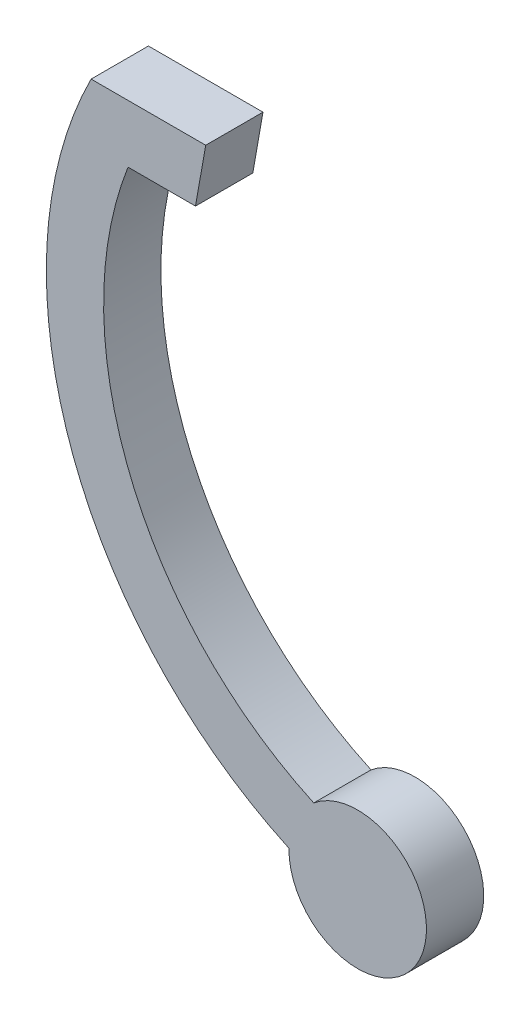
ISO-10303-21;
HEADER;
FILE_DESCRIPTION(('STEP AP214'),'2;1');
FILE_NAME('part.step','',(''),(''),'','','');
FILE_SCHEMA(('AUTOMOTIVE_DESIGN { 1 0 10303 214 1 1 1 1 }'));
ENDSEC;
DATA;
#1=APPLICATION_CONTEXT('core data for automotive mechanical design processes');
#2=APPLICATION_PROTOCOL_DEFINITION('international standard','automotive_design',2000,#1);
#3=PRODUCT_CONTEXT('',#1,'mechanical');
#4=PRODUCT('Part','Part','',(#3));
#5=PRODUCT_RELATED_PRODUCT_CATEGORY('part','',(#4));
#6=PRODUCT_DEFINITION_FORMATION('','',#4);
#7=PRODUCT_DEFINITION_CONTEXT('part definition',#1,'design');
#8=PRODUCT_DEFINITION('design','',#6,#7);
#9=PRODUCT_DEFINITION_SHAPE('','',#8);
#10=(LENGTH_UNIT() NAMED_UNIT(*) SI_UNIT(.MILLI.,.METRE.));
#11=(NAMED_UNIT(*) PLANE_ANGLE_UNIT() SI_UNIT($,.RADIAN.));
#12=(NAMED_UNIT(*) SI_UNIT($,.STERADIAN.) SOLID_ANGLE_UNIT());
#13=UNCERTAINTY_MEASURE_WITH_UNIT(LENGTH_MEASURE(1.E-05),#10,'distance_accuracy_value','');
#14=(GEOMETRIC_REPRESENTATION_CONTEXT(3) GLOBAL_UNCERTAINTY_ASSIGNED_CONTEXT((#13)) GLOBAL_UNIT_ASSIGNED_CONTEXT((#10,
#11,#12)) REPRESENTATION_CONTEXT('',''));
#15=CARTESIAN_POINT('',(0.,0.,0.));
#16=DIRECTION('',(0.,0.,1.));
#17=DIRECTION('',(1.,0.,0.));
#18=AXIS2_PLACEMENT_3D('',#15,#16,#17);
#19=CARTESIAN_POINT('',(9.26295980228753,33.1948316585105,-4.));
#20=DIRECTION('',(0.,0.,1.));
#21=DIRECTION('',(1.,0.,0.));
#22=AXIS2_PLACEMENT_3D('',#19,#20,#21);
#23=CYLINDRICAL_SURFACE('',#22,36.4391896161672);
#24=CARTESIAN_POINT('',(9.26295980228753,33.1948316585105,5.));
#25=DIRECTION('',(0.,0.,1.));
#26=DIRECTION('',(1.,0.,0.));
#27=AXIS2_PLACEMENT_3D('',#24,#25,#26);
#28=CIRCLE('',#27,36.4391896161672);
#29=CARTESIAN_POINT('',(-23.2673563555841,49.6141212458192,5.));
#30=VERTEX_POINT('',#29);
#31=CARTESIAN_POINT('',(-5.99906740376908,0.10578414359131,5.));
#32=VERTEX_POINT('',#31);
#33=EDGE_CURVE('E128',#30,#32,#28,.T.);
#34=ORIENTED_EDGE('',*,*,#33,.F.);
#35=DIRECTION('',(0.,0.,1.));
#36=VECTOR('',#35,1.);
#37=CARTESIAN_POINT('',(-23.2673563555841,49.6141212458192,-4.));
#38=LINE('',#37,#36);
#39=CARTESIAN_POINT('',(-23.2673563555841,49.6141212458192,0.));
#40=VERTEX_POINT('',#39);
#41=EDGE_CURVE('E109',#40,#30,#38,.T.);
#42=ORIENTED_EDGE('',*,*,#41,.F.);
#43=CARTESIAN_POINT('',(9.26295980228753,33.1948316585105,0.));
#44=DIRECTION('',(0.,0.,-1.));
#45=DIRECTION('',(-1.,0.,0.));
#46=AXIS2_PLACEMENT_3D('',#43,#44,#45);
#47=CIRCLE('',#46,36.4391896161672);
#48=CARTESIAN_POINT('',(-5.99906740376908,0.10578414359131,0.));
#49=VERTEX_POINT('',#48);
#50=EDGE_CURVE('E91',#49,#40,#47,.T.);
#51=ORIENTED_EDGE('',*,*,#50,.F.);
#52=DIRECTION('',(0.,0.,1.));
#53=VECTOR('',#52,1.);
#54=CARTESIAN_POINT('',(-5.99906740376907,0.10578414359131,-4.));
#55=LINE('',#54,#53);
#56=EDGE_CURVE('E111',#49,#32,#55,.T.);
#57=ORIENTED_EDGE('',*,*,#56,.T.);
#58=EDGE_LOOP('',(#34,#42,#51,#57));
#59=FACE_BOUND('',#58,.T.);
#60=ADVANCED_FACE('F36',(#59),#23,.T.);
#61=CARTESIAN_POINT('',(-23.2673563555841,49.6141212458192,-4.));
#62=DIRECTION('',(0.,-1.,0.));
#63=DIRECTION('',(0.,0.,-1.));
#64=AXIS2_PLACEMENT_3D('',#61,#62,#63);
#65=PLANE('',#64);
#66=DIRECTION('',(1.,0.,0.));
#67=VECTOR('',#66,1.);
#68=CARTESIAN_POINT('',(-31.0251504460411,49.6141212458192,5.));
#69=LINE('',#68,#67);
#70=CARTESIAN_POINT('',(-13.2673563555841,49.6141212458192,5.));
#71=VERTEX_POINT('',#70);
#72=EDGE_CURVE('E96',#30,#71,#69,.T.);
#73=ORIENTED_EDGE('',*,*,#72,.T.);
#74=DIRECTION('',(0.,0.,1.));
#75=VECTOR('',#74,1.);
#76=CARTESIAN_POINT('',(-13.2673563555841,49.6141212458192,-4.));
#77=LINE('',#76,#75);
#78=CARTESIAN_POINT('',(-13.2673563555841,49.6141212458192,0.));
#79=VERTEX_POINT('',#78);
#80=EDGE_CURVE('E103',#79,#71,#77,.T.);
#81=ORIENTED_EDGE('',*,*,#80,.F.);
#82=DIRECTION('',(-1.,0.,0.));
#83=VECTOR('',#82,1.);
#84=CARTESIAN_POINT('',(-4.47625446970178,49.6141212458192,0.));
#85=LINE('',#84,#83);
#86=EDGE_CURVE('E86',#79,#40,#85,.T.);
#87=ORIENTED_EDGE('',*,*,#86,.T.);
#88=ORIENTED_EDGE('',*,*,#41,.T.);
#89=EDGE_LOOP('',(#73,#81,#87,#88));
#90=FACE_BOUND('',#89,.T.);
#91=ADVANCED_FACE('F108',(#90),#65,.F.);
#92=CARTESIAN_POINT('',(-13.2673563555841,49.6141212458192,-4.));
#93=DIRECTION('',(-0.984807753012207,0.173648177666934,0.));
#94=DIRECTION('',(-0.173648177666934,-0.984807753012207,0.));
#95=AXIS2_PLACEMENT_3D('',#92,#93,#94);
#96=PLANE('',#95);
#97=DIRECTION('',(0.173648177666934,0.984807753012207,0.));
#98=VECTOR('',#97,1.);
#99=CARTESIAN_POINT('',(-13.2673563555841,49.6141212458192,5.));
#100=LINE('',#99,#98);
#101=CARTESIAN_POINT('',(-14.1573566450321,44.5666787848182,5.));
#102=VERTEX_POINT('',#101);
#103=EDGE_CURVE('E136',#102,#71,#100,.T.);
#104=ORIENTED_EDGE('',*,*,#103,.F.);
#105=DIRECTION('',(0.,0.,1.));
#106=VECTOR('',#105,1.);
#107=CARTESIAN_POINT('',(-14.1573566450321,44.5666787848182,-4.));
#108=LINE('',#107,#106);
#109=CARTESIAN_POINT('',(-14.1573566450321,44.5666787848182,0.));
#110=VERTEX_POINT('',#109);
#111=EDGE_CURVE('E105',#110,#102,#108,.T.);
#112=ORIENTED_EDGE('',*,*,#111,.F.);
#113=DIRECTION('',(-0.173648177666934,-0.984807753012207,0.));
#114=VECTOR('',#113,1.);
#115=CARTESIAN_POINT('',(-13.2673563555841,49.6141212458192,0.));
#116=LINE('',#115,#114);
#117=EDGE_CURVE('E89',#79,#110,#116,.T.);
#118=ORIENTED_EDGE('',*,*,#117,.F.);
#119=ORIENTED_EDGE('',*,*,#80,.T.);
#120=EDGE_LOOP('',(#104,#112,#118,#119));
#121=FACE_BOUND('',#120,.T.);
#122=ADVANCED_FACE('F102',(#121),#96,.F.);
#123=CARTESIAN_POINT('',(-14.1573566450321,44.5666787848182,-4.));
#124=DIRECTION('',(0.,1.,0.));
#125=DIRECTION('',(-1.,0.,0.));
#126=AXIS2_PLACEMENT_3D('',#123,#124,#125);
#127=PLANE('',#126);
#128=DIRECTION('',(1.,0.,0.));
#129=VECTOR('',#128,1.);
#130=CARTESIAN_POINT('',(-14.1573566450321,44.5666787848182,5.));
#131=LINE('',#130,#129);
#132=CARTESIAN_POINT('',(-20.0475116483255,44.5666787848182,5.));
#133=VERTEX_POINT('',#132);
#134=EDGE_CURVE('E134',#133,#102,#131,.T.);
#135=ORIENTED_EDGE('',*,*,#134,.F.);
#136=DIRECTION('',(0.,0.,1.));
#137=VECTOR('',#136,1.);
#138=CARTESIAN_POINT('',(-20.0475116483255,44.5666787848182,-4.));
#139=LINE('',#138,#137);
#140=CARTESIAN_POINT('',(-20.0475116483255,44.5666787848182,0.));
#141=VERTEX_POINT('',#140);
#142=EDGE_CURVE('E113',#141,#133,#139,.T.);
#143=ORIENTED_EDGE('',*,*,#142,.F.);
#144=DIRECTION('',(-1.,0.,0.));
#145=VECTOR('',#144,1.);
#146=CARTESIAN_POINT('',(-14.1573566450321,44.5666787848182,0.));
#147=LINE('',#146,#145);
#148=EDGE_CURVE('E51',#110,#141,#147,.T.);
#149=ORIENTED_EDGE('',*,*,#148,.F.);
#150=ORIENTED_EDGE('',*,*,#111,.T.);
#151=EDGE_LOOP('',(#135,#143,#149,#150));
#152=FACE_BOUND('',#151,.T.);
#153=ADVANCED_FACE('F143',(#152),#127,.F.);
#154=CARTESIAN_POINT('',(9.26295980228753,33.1948316585105,-4.));
#155=DIRECTION('',(0.,0.,1.));
#156=DIRECTION('',(1.,0.,0.));
#157=AXIS2_PLACEMENT_3D('',#154,#155,#156);
#158=CYLINDRICAL_SURFACE('',#157,31.4391896161672);
#159=CARTESIAN_POINT('',(9.26295980228753,33.1948316585105,5.));
#160=DIRECTION('',(0.,0.,1.));
#161=DIRECTION('',(1.,0.,0.));
#162=AXIS2_PLACEMENT_3D('',#159,#160,#161);
#163=CIRCLE('',#162,31.4391896161672);
#164=CARTESIAN_POINT('',(-3.83534680685851,4.61412124581921,5.));
#165=VERTEX_POINT('',#164);
#166=EDGE_CURVE('E12',#165,#133,#163,.F.);
#167=ORIENTED_EDGE('',*,*,#166,.F.);
#168=DIRECTION('',(0.,0.,1.));
#169=VECTOR('',#168,1.);
#170=CARTESIAN_POINT('',(-3.83534680685851,4.61412124581921,-4.));
#171=LINE('',#170,#169);
#172=CARTESIAN_POINT('',(-3.83534680685851,4.61412124581921,0.));
#173=VERTEX_POINT('',#172);
#174=EDGE_CURVE('E124',#173,#165,#171,.T.);
#175=ORIENTED_EDGE('',*,*,#174,.F.);
#176=CARTESIAN_POINT('',(9.26295980228753,33.1948316585105,0.));
#177=DIRECTION('',(0.,0.,-1.));
#178=DIRECTION('',(-1.,0.,0.));
#179=AXIS2_PLACEMENT_3D('',#176,#177,#178);
#180=CIRCLE('',#179,31.4391896161672);
#181=EDGE_CURVE('E44',#141,#173,#180,.F.);
#182=ORIENTED_EDGE('',*,*,#181,.F.);
#183=ORIENTED_EDGE('',*,*,#142,.T.);
#184=EDGE_LOOP('',(#167,#175,#182,#183));
#185=FACE_BOUND('',#184,.T.);
#186=ADVANCED_FACE('F125',(#185),#158,.F.);
#187=CARTESIAN_POINT('',(0.,0.,5.));
#188=DIRECTION('',(0.,0.,-1.));
#189=DIRECTION('',(-1.,0.,0.));
#190=AXIS2_PLACEMENT_3D('',#187,#188,#189);
#191=CYLINDRICAL_SURFACE('',#190,6.);
#192=CARTESIAN_POINT('',(0.,0.,5.));
#193=DIRECTION('',(0.,0.,1.));
#194=DIRECTION('',(1.,0.,0.));
#195=AXIS2_PLACEMENT_3D('',#192,#193,#194);
#196=CIRCLE('',#195,6.);
#197=EDGE_CURVE('E120',#165,#32,#196,.F.);
#198=ORIENTED_EDGE('',*,*,#197,.T.);
#199=ORIENTED_EDGE('',*,*,#56,.F.);
#200=CARTESIAN_POINT('',(0.,0.,0.));
#201=DIRECTION('',(0.,0.,1.));
#202=DIRECTION('',(1.,0.,0.));
#203=AXIS2_PLACEMENT_3D('',#200,#201,#202);
#204=CIRCLE('',#203,6.);
#205=EDGE_CURVE('E119',#173,#49,#204,.F.);
#206=ORIENTED_EDGE('',*,*,#205,.F.);
#207=ORIENTED_EDGE('',*,*,#174,.T.);
#208=EDGE_LOOP('',(#198,#199,#206,#207));
#209=FACE_BOUND('',#208,.T.);
#210=ADVANCED_FACE('F38',(#209),#191,.T.);
#211=CARTESIAN_POINT('',(0.,0.,5.));
#212=DIRECTION('',(0.,0.,1.));
#213=DIRECTION('',(1.,0.,0.));
#214=AXIS2_PLACEMENT_3D('',#211,#212,#213);
#215=PLANE('',#214);
#216=ORIENTED_EDGE('',*,*,#197,.F.);
#217=ORIENTED_EDGE('',*,*,#166,.T.);
#218=ORIENTED_EDGE('',*,*,#134,.T.);
#219=ORIENTED_EDGE('',*,*,#103,.T.);
#220=ORIENTED_EDGE('',*,*,#72,.F.);
#221=ORIENTED_EDGE('',*,*,#33,.T.);
#222=EDGE_LOOP('',(#216,#217,#218,#219,#220,#221));
#223=FACE_BOUND('',#222,.T.);
#224=ADVANCED_FACE('F145',(#223),#215,.T.);
#225=CARTESIAN_POINT('',(0.,0.,0.));
#226=DIRECTION('',(0.,0.,1.));
#227=DIRECTION('',(1.,0.,0.));
#228=AXIS2_PLACEMENT_3D('',#225,#226,#227);
#229=PLANE('',#228);
#230=ORIENTED_EDGE('',*,*,#205,.T.);
#231=ORIENTED_EDGE('',*,*,#50,.T.);
#232=ORIENTED_EDGE('',*,*,#86,.F.);
#233=ORIENTED_EDGE('',*,*,#117,.T.);
#234=ORIENTED_EDGE('',*,*,#148,.T.);
#235=ORIENTED_EDGE('',*,*,#181,.T.);
#236=EDGE_LOOP('',(#230,#231,#232,#233,#234,#235));
#237=FACE_BOUND('',#236,.T.);
#238=ADVANCED_FACE('F88',(#237),#229,.F.);
#239=CLOSED_SHELL('',(#60,#91,#122,#153,#186,#210,#224,#238));
#240=MANIFOLD_SOLID_BREP('B2',#239);
#241=ADVANCED_BREP_SHAPE_REPRESENTATION('',(#18,#240),#14);
#242=SHAPE_DEFINITION_REPRESENTATION(#9,#241);
ENDSEC;
END-ISO-10303-21;
